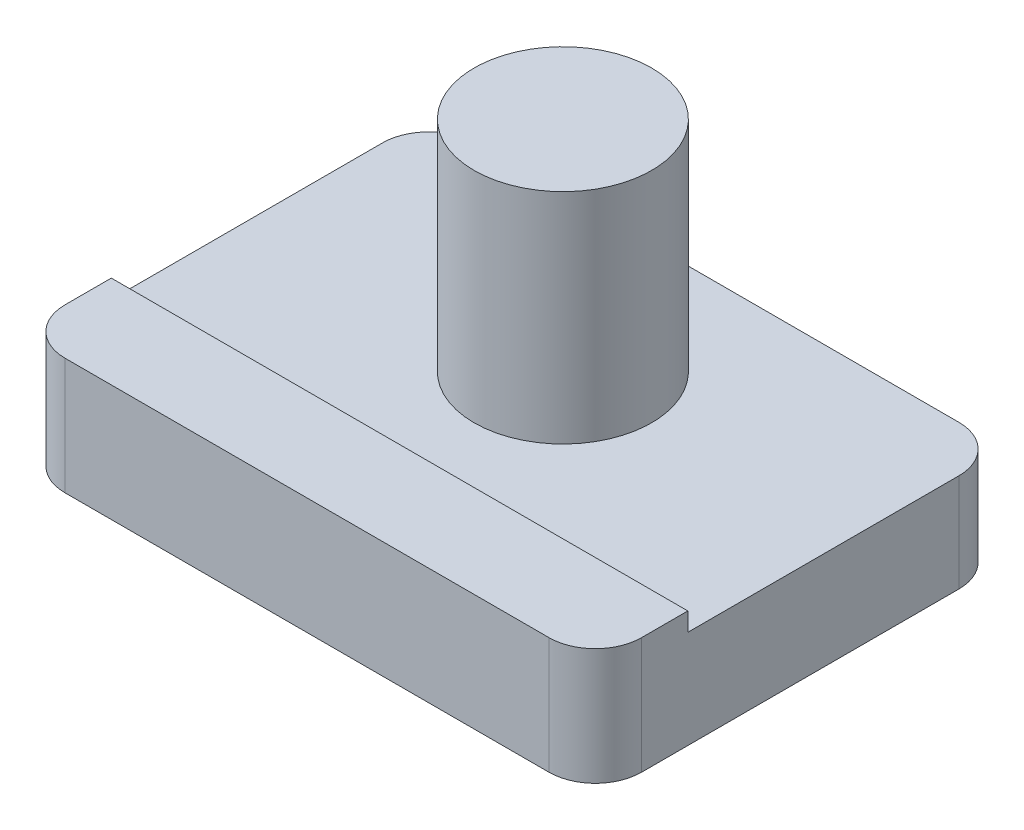
ISO-10303-21;
HEADER;
FILE_DESCRIPTION(('STEP AP214'),'2;1');
FILE_NAME('part.step','',(''),(''),'','','');
FILE_SCHEMA(('AUTOMOTIVE_DESIGN { 1 0 10303 214 1 1 1 1 }'));
ENDSEC;
DATA;
#1=APPLICATION_CONTEXT('core data for automotive mechanical design processes');
#2=APPLICATION_PROTOCOL_DEFINITION('international standard','automotive_design',2000,#1);
#3=PRODUCT_CONTEXT('',#1,'mechanical');
#4=PRODUCT('Part','Part','',(#3));
#5=PRODUCT_RELATED_PRODUCT_CATEGORY('part','',(#4));
#6=PRODUCT_DEFINITION_FORMATION('','',#4);
#7=PRODUCT_DEFINITION_CONTEXT('part definition',#1,'design');
#8=PRODUCT_DEFINITION('design','',#6,#7);
#9=PRODUCT_DEFINITION_SHAPE('','',#8);
#10=(LENGTH_UNIT() NAMED_UNIT(*) SI_UNIT(.MILLI.,.METRE.));
#11=(NAMED_UNIT(*) PLANE_ANGLE_UNIT() SI_UNIT($,.RADIAN.));
#12=(NAMED_UNIT(*) SI_UNIT($,.STERADIAN.) SOLID_ANGLE_UNIT());
#13=UNCERTAINTY_MEASURE_WITH_UNIT(LENGTH_MEASURE(1.E-05),#10,'distance_accuracy_value','');
#14=(GEOMETRIC_REPRESENTATION_CONTEXT(3) GLOBAL_UNCERTAINTY_ASSIGNED_CONTEXT((#13)) GLOBAL_UNIT_ASSIGNED_CONTEXT((#10,
#11,#12)) REPRESENTATION_CONTEXT('',''));
#15=CARTESIAN_POINT('',(0.,0.,0.));
#16=DIRECTION('',(0.,0.,1.));
#17=DIRECTION('',(1.,0.,0.));
#18=AXIS2_PLACEMENT_3D('',#15,#16,#17);
#19=CARTESIAN_POINT('',(31.15,10.6,0.));
#20=DIRECTION('',(1.,0.,0.));
#21=DIRECTION('',(0.,0.,-1.));
#22=AXIS2_PLACEMENT_3D('',#19,#20,#21);
#23=PLANE('',#22);
#24=DIRECTION('',(0.,0.,1.));
#25=VECTOR('',#24,1.);
#26=CARTESIAN_POINT('',(31.15,12.6,0.));
#27=LINE('',#26,#25);
#28=CARTESIAN_POINT('',(31.15,12.6,12.15));
#29=VERTEX_POINT('',#28);
#30=CARTESIAN_POINT('',(31.15,12.6,17.15));
#31=VERTEX_POINT('',#30);
#32=EDGE_CURVE('E127',#29,#31,#27,.T.);
#33=ORIENTED_EDGE('',*,*,#32,.T.);
#34=DIRECTION('',(0.,-1.,0.));
#35=VECTOR('',#34,1.);
#36=CARTESIAN_POINT('',(31.15,0.,17.15));
#37=LINE('',#36,#35);
#38=CARTESIAN_POINT('',(31.15,0.,17.15));
#39=VERTEX_POINT('',#38);
#40=EDGE_CURVE('E11',#31,#39,#37,.T.);
#41=ORIENTED_EDGE('',*,*,#40,.T.);
#42=DIRECTION('',(0.,0.,1.));
#43=VECTOR('',#42,1.);
#44=CARTESIAN_POINT('',(31.15,0.,0.));
#45=LINE('',#44,#43);
#46=CARTESIAN_POINT('',(31.15,0.,-17.15));
#47=VERTEX_POINT('',#46);
#48=EDGE_CURVE('E135',#47,#39,#45,.T.);
#49=ORIENTED_EDGE('',*,*,#48,.F.);
#50=DIRECTION('',(0.,-1.,0.));
#51=VECTOR('',#50,1.);
#52=CARTESIAN_POINT('',(31.15,10.6,-17.15));
#53=LINE('',#52,#51);
#54=CARTESIAN_POINT('',(31.15,10.6,-17.15));
#55=VERTEX_POINT('',#54);
#56=EDGE_CURVE('E56',#47,#55,#53,.F.);
#57=ORIENTED_EDGE('',*,*,#56,.T.);
#58=DIRECTION('',(0.,0.,1.));
#59=VECTOR('',#58,1.);
#60=CARTESIAN_POINT('',(31.15,10.6,0.));
#61=LINE('',#60,#59);
#62=CARTESIAN_POINT('',(31.15,10.6,12.15));
#63=VERTEX_POINT('',#62);
#64=EDGE_CURVE('E129',#55,#63,#61,.T.);
#65=ORIENTED_EDGE('',*,*,#64,.T.);
#66=DIRECTION('',(0.,-1.,0.));
#67=VECTOR('',#66,1.);
#68=CARTESIAN_POINT('',(31.15,12.6,12.15));
#69=LINE('',#68,#67);
#70=EDGE_CURVE('E125',#29,#63,#69,.T.);
#71=ORIENTED_EDGE('',*,*,#70,.F.);
#72=EDGE_LOOP('',(#33,#41,#49,#57,#65,#71));
#73=FACE_BOUND('',#72,.T.);
#74=ADVANCED_FACE('F47',(#73),#23,.T.);
#75=CARTESIAN_POINT('',(0.,10.6,-22.15));
#76=DIRECTION('',(0.,0.,-1.));
#77=DIRECTION('',(-1.,0.,0.));
#78=AXIS2_PLACEMENT_3D('',#75,#76,#77);
#79=PLANE('',#78);
#80=DIRECTION('',(1.,0.,0.));
#81=VECTOR('',#80,1.);
#82=CARTESIAN_POINT('',(0.,0.,-22.15));
#83=LINE('',#82,#81);
#84=CARTESIAN_POINT('',(-26.15,0.,-22.15));
#85=VERTEX_POINT('',#84);
#86=CARTESIAN_POINT('',(26.15,0.,-22.15));
#87=VERTEX_POINT('',#86);
#88=EDGE_CURVE('E184',#85,#87,#83,.T.);
#89=ORIENTED_EDGE('',*,*,#88,.F.);
#90=DIRECTION('',(0.,-1.,0.));
#91=VECTOR('',#90,1.);
#92=CARTESIAN_POINT('',(-26.15,10.6,-22.15));
#93=LINE('',#92,#91);
#94=CARTESIAN_POINT('',(-26.15,10.6,-22.15));
#95=VERTEX_POINT('',#94);
#96=EDGE_CURVE('E225',#85,#95,#93,.F.);
#97=ORIENTED_EDGE('',*,*,#96,.T.);
#98=DIRECTION('',(1.,0.,0.));
#99=VECTOR('',#98,1.);
#100=CARTESIAN_POINT('',(0.,10.6,-22.15));
#101=LINE('',#100,#99);
#102=CARTESIAN_POINT('',(26.15,10.6,-22.15));
#103=VERTEX_POINT('',#102);
#104=EDGE_CURVE('E170',#95,#103,#101,.T.);
#105=ORIENTED_EDGE('',*,*,#104,.T.);
#106=DIRECTION('',(0.,-1.,0.));
#107=VECTOR('',#106,1.);
#108=CARTESIAN_POINT('',(26.15,10.6,-22.15));
#109=LINE('',#108,#107);
#110=EDGE_CURVE('E221',#103,#87,#109,.T.);
#111=ORIENTED_EDGE('',*,*,#110,.T.);
#112=EDGE_LOOP('',(#89,#97,#105,#111));
#113=FACE_BOUND('',#112,.T.);
#114=ADVANCED_FACE('F248',(#113),#79,.T.);
#115=CARTESIAN_POINT('',(-31.15,10.6,0.));
#116=DIRECTION('',(1.,0.,0.));
#117=DIRECTION('',(0.,0.,-1.));
#118=AXIS2_PLACEMENT_3D('',#115,#116,#117);
#119=PLANE('',#118);
#120=DIRECTION('',(0.,0.,1.));
#121=VECTOR('',#120,1.);
#122=CARTESIAN_POINT('',(-31.15,0.,0.));
#123=LINE('',#122,#121);
#124=CARTESIAN_POINT('',(-31.15,0.,-17.15));
#125=VERTEX_POINT('',#124);
#126=CARTESIAN_POINT('',(-31.15,0.,17.15));
#127=VERTEX_POINT('',#126);
#128=EDGE_CURVE('E171',#125,#127,#123,.T.);
#129=ORIENTED_EDGE('',*,*,#128,.T.);
#130=DIRECTION('',(0.,-1.,0.));
#131=VECTOR('',#130,1.);
#132=CARTESIAN_POINT('',(-31.15,10.6,17.15));
#133=LINE('',#132,#131);
#134=CARTESIAN_POINT('',(-31.15,12.6,17.15));
#135=VERTEX_POINT('',#134);
#136=EDGE_CURVE('E213',#127,#135,#133,.F.);
#137=ORIENTED_EDGE('',*,*,#136,.T.);
#138=DIRECTION('',(0.,0.,1.));
#139=VECTOR('',#138,1.);
#140=CARTESIAN_POINT('',(-31.15,12.6,0.));
#141=LINE('',#140,#139);
#142=CARTESIAN_POINT('',(-31.15,12.6,12.15));
#143=VERTEX_POINT('',#142);
#144=EDGE_CURVE('E153',#143,#135,#141,.T.);
#145=ORIENTED_EDGE('',*,*,#144,.F.);
#146=DIRECTION('',(0.,-1.,0.));
#147=VECTOR('',#146,1.);
#148=CARTESIAN_POINT('',(-31.15,12.6,12.15));
#149=LINE('',#148,#147);
#150=CARTESIAN_POINT('',(-31.15,10.6,12.15));
#151=VERTEX_POINT('',#150);
#152=EDGE_CURVE('E136',#143,#151,#149,.T.);
#153=ORIENTED_EDGE('',*,*,#152,.T.);
#154=DIRECTION('',(0.,0.,1.));
#155=VECTOR('',#154,1.);
#156=CARTESIAN_POINT('',(-31.15,10.6,0.));
#157=LINE('',#156,#155);
#158=CARTESIAN_POINT('',(-31.15,10.6,-17.15));
#159=VERTEX_POINT('',#158);
#160=EDGE_CURVE('E174',#159,#151,#157,.T.);
#161=ORIENTED_EDGE('',*,*,#160,.F.);
#162=DIRECTION('',(0.,-1.,0.));
#163=VECTOR('',#162,1.);
#164=CARTESIAN_POINT('',(-31.15,0.,-17.15));
#165=LINE('',#164,#163);
#166=EDGE_CURVE('E209',#159,#125,#165,.T.);
#167=ORIENTED_EDGE('',*,*,#166,.T.);
#168=EDGE_LOOP('',(#129,#137,#145,#153,#161,#167));
#169=FACE_BOUND('',#168,.T.);
#170=ADVANCED_FACE('F240',(#169),#119,.F.);
#171=CARTESIAN_POINT('',(0.,10.6,0.));
#172=DIRECTION('',(0.,1.,0.));
#173=DIRECTION('',(0.,0.,1.));
#174=AXIS2_PLACEMENT_3D('',#171,#172,#173);
#175=PLANE('',#174);
#176=CARTESIAN_POINT('',(0.,10.6,-5.5002078342377));
#177=DIRECTION('',(0.,1.,0.));
#178=DIRECTION('',(0.,0.,1.));
#179=AXIS2_PLACEMENT_3D('',#176,#177,#178);
#180=CIRCLE('',#179,9.59372532332558);
#181=CARTESIAN_POINT('',(0.,10.6,4.09351748908788));
#182=VERTEX_POINT('',#181);
#183=EDGE_CURVE('E302',#182,#182,#180,.T.);
#184=ORIENTED_EDGE('',*,*,#183,.F.);
#185=EDGE_LOOP('',(#184));
#186=FACE_BOUND('',#185,.T.);
#187=ORIENTED_EDGE('',*,*,#104,.F.);
#188=CARTESIAN_POINT('',(-26.15,10.6,-17.15));
#189=DIRECTION('',(0.,1.,0.));
#190=DIRECTION('',(0.,0.,1.));
#191=AXIS2_PLACEMENT_3D('',#188,#189,#190);
#192=CIRCLE('',#191,5.);
#193=EDGE_CURVE('E230',#95,#159,#192,.T.);
#194=ORIENTED_EDGE('',*,*,#193,.T.);
#195=ORIENTED_EDGE('',*,*,#160,.T.);
#196=DIRECTION('',(1.,0.,0.));
#197=VECTOR('',#196,1.);
#198=CARTESIAN_POINT('',(0.,10.6,12.15));
#199=LINE('',#198,#197);
#200=EDGE_CURVE('E177',#151,#63,#199,.T.);
#201=ORIENTED_EDGE('',*,*,#200,.T.);
#202=ORIENTED_EDGE('',*,*,#64,.F.);
#203=CARTESIAN_POINT('',(26.15,10.6,-17.15));
#204=DIRECTION('',(0.,1.,0.));
#205=DIRECTION('',(0.,0.,1.));
#206=AXIS2_PLACEMENT_3D('',#203,#204,#205);
#207=CIRCLE('',#206,5.);
#208=EDGE_CURVE('E69',#55,#103,#207,.T.);
#209=ORIENTED_EDGE('',*,*,#208,.T.);
#210=EDGE_LOOP('',(#187,#194,#195,#201,#202,#209));
#211=FACE_BOUND('',#210,.T.);
#212=ADVANCED_FACE('F235',(#186,#211),#175,.T.);
#213=CARTESIAN_POINT('',(0.,0.,0.));
#214=DIRECTION('',(0.,1.,0.));
#215=DIRECTION('',(0.,0.,1.));
#216=AXIS2_PLACEMENT_3D('',#213,#214,#215);
#217=PLANE('',#216);
#218=DIRECTION('',(1.,0.,0.));
#219=VECTOR('',#218,1.);
#220=CARTESIAN_POINT('',(0.,0.,22.15));
#221=LINE('',#220,#219);
#222=CARTESIAN_POINT('',(-26.15,0.,22.15));
#223=VERTEX_POINT('',#222);
#224=CARTESIAN_POINT('',(26.15,0.,22.15));
#225=VERTEX_POINT('',#224);
#226=EDGE_CURVE('E147',#223,#225,#221,.T.);
#227=ORIENTED_EDGE('',*,*,#226,.F.);
#228=CARTESIAN_POINT('',(-26.15,0.,17.15));
#229=DIRECTION('',(0.,1.,0.));
#230=DIRECTION('',(0.,0.,1.));
#231=AXIS2_PLACEMENT_3D('',#228,#229,#230);
#232=CIRCLE('',#231,5.);
#233=EDGE_CURVE('E206',#223,#127,#232,.F.);
#234=ORIENTED_EDGE('',*,*,#233,.T.);
#235=ORIENTED_EDGE('',*,*,#128,.F.);
#236=CARTESIAN_POINT('',(-26.15,0.,-17.15));
#237=DIRECTION('',(0.,1.,0.));
#238=DIRECTION('',(0.,0.,1.));
#239=AXIS2_PLACEMENT_3D('',#236,#237,#238);
#240=CIRCLE('',#239,5.);
#241=EDGE_CURVE('E203',#125,#85,#240,.F.);
#242=ORIENTED_EDGE('',*,*,#241,.T.);
#243=ORIENTED_EDGE('',*,*,#88,.T.);
#244=CARTESIAN_POINT('',(26.15,0.,-17.15));
#245=DIRECTION('',(0.,1.,0.));
#246=DIRECTION('',(0.,0.,1.));
#247=AXIS2_PLACEMENT_3D('',#244,#245,#246);
#248=CIRCLE('',#247,5.);
#249=EDGE_CURVE('E197',#87,#47,#248,.F.);
#250=ORIENTED_EDGE('',*,*,#249,.T.);
#251=ORIENTED_EDGE('',*,*,#48,.T.);
#252=CARTESIAN_POINT('',(26.15,0.,17.15));
#253=DIRECTION('',(0.,1.,0.));
#254=DIRECTION('',(0.,0.,1.));
#255=AXIS2_PLACEMENT_3D('',#252,#253,#254);
#256=CIRCLE('',#255,5.);
#257=EDGE_CURVE('E200',#39,#225,#256,.F.);
#258=ORIENTED_EDGE('',*,*,#257,.T.);
#259=EDGE_LOOP('',(#227,#234,#235,#242,#243,#250,#251,#258));
#260=FACE_BOUND('',#259,.T.);
#261=ADVANCED_FACE('F246',(#260),#217,.F.);
#262=CARTESIAN_POINT('',(0.,12.6,12.15));
#263=DIRECTION('',(0.,0.,-1.));
#264=DIRECTION('',(-1.,0.,0.));
#265=AXIS2_PLACEMENT_3D('',#262,#263,#264);
#266=PLANE('',#265);
#267=ORIENTED_EDGE('',*,*,#200,.F.);
#268=ORIENTED_EDGE('',*,*,#152,.F.);
#269=DIRECTION('',(1.,0.,0.));
#270=VECTOR('',#269,1.);
#271=CARTESIAN_POINT('',(0.,12.6,12.15));
#272=LINE('',#271,#270);
#273=EDGE_CURVE('E142',#143,#29,#272,.T.);
#274=ORIENTED_EDGE('',*,*,#273,.T.);
#275=ORIENTED_EDGE('',*,*,#70,.T.);
#276=EDGE_LOOP('',(#267,#268,#274,#275));
#277=FACE_BOUND('',#276,.T.);
#278=ADVANCED_FACE('F149',(#277),#266,.T.);
#279=CARTESIAN_POINT('',(0.,12.6,22.15));
#280=DIRECTION('',(0.,0.,-1.));
#281=DIRECTION('',(-1.,0.,0.));
#282=AXIS2_PLACEMENT_3D('',#279,#280,#281);
#283=PLANE('',#282);
#284=DIRECTION('',(1.,0.,0.));
#285=VECTOR('',#284,1.);
#286=CARTESIAN_POINT('',(0.,12.6,22.15));
#287=LINE('',#286,#285);
#288=CARTESIAN_POINT('',(-26.15,12.6,22.15));
#289=VERTEX_POINT('',#288);
#290=CARTESIAN_POINT('',(26.15,12.6,22.15));
#291=VERTEX_POINT('',#290);
#292=EDGE_CURVE('E156',#289,#291,#287,.T.);
#293=ORIENTED_EDGE('',*,*,#292,.F.);
#294=DIRECTION('',(0.,-1.,0.));
#295=VECTOR('',#294,1.);
#296=CARTESIAN_POINT('',(-26.15,12.6,22.15));
#297=LINE('',#296,#295);
#298=EDGE_CURVE('E193',#289,#223,#297,.T.);
#299=ORIENTED_EDGE('',*,*,#298,.T.);
#300=ORIENTED_EDGE('',*,*,#226,.T.);
#301=DIRECTION('',(0.,-1.,0.));
#302=VECTOR('',#301,1.);
#303=CARTESIAN_POINT('',(26.15,12.6,22.15));
#304=LINE('',#303,#302);
#305=EDGE_CURVE('E180',#225,#291,#304,.F.);
#306=ORIENTED_EDGE('',*,*,#305,.T.);
#307=EDGE_LOOP('',(#293,#299,#300,#306));
#308=FACE_BOUND('',#307,.T.);
#309=ADVANCED_FACE('F256',(#308),#283,.F.);
#310=CARTESIAN_POINT('',(0.,12.6,0.));
#311=DIRECTION('',(0.,1.,0.));
#312=DIRECTION('',(0.,0.,1.));
#313=AXIS2_PLACEMENT_3D('',#310,#311,#312);
#314=PLANE('',#313);
#315=ORIENTED_EDGE('',*,*,#144,.T.);
#316=CARTESIAN_POINT('',(-26.15,12.6,17.15));
#317=DIRECTION('',(0.,1.,0.));
#318=DIRECTION('',(0.,0.,1.));
#319=AXIS2_PLACEMENT_3D('',#316,#317,#318);
#320=CIRCLE('',#319,5.);
#321=EDGE_CURVE('E218',#135,#289,#320,.T.);
#322=ORIENTED_EDGE('',*,*,#321,.T.);
#323=ORIENTED_EDGE('',*,*,#292,.T.);
#324=CARTESIAN_POINT('',(26.15,12.6,17.15));
#325=DIRECTION('',(0.,1.,0.));
#326=DIRECTION('',(0.,0.,1.));
#327=AXIS2_PLACEMENT_3D('',#324,#325,#326);
#328=CIRCLE('',#327,5.);
#329=EDGE_CURVE('E145',#291,#31,#328,.T.);
#330=ORIENTED_EDGE('',*,*,#329,.T.);
#331=ORIENTED_EDGE('',*,*,#32,.F.);
#332=ORIENTED_EDGE('',*,*,#273,.F.);
#333=EDGE_LOOP('',(#315,#322,#323,#330,#331,#332));
#334=FACE_BOUND('',#333,.T.);
#335=ADVANCED_FACE('F141',(#334),#314,.T.);
#336=CARTESIAN_POINT('',(0.,34.22,-5.5002078342377));
#337=DIRECTION('',(0.,-1.,0.));
#338=DIRECTION('',(0.,0.,-1.));
#339=AXIS2_PLACEMENT_3D('',#336,#337,#338);
#340=CYLINDRICAL_SURFACE('',#339,9.59372532332558);
#341=CARTESIAN_POINT('',(0.,34.22,-5.5002078342377));
#342=DIRECTION('',(0.,1.,0.));
#343=DIRECTION('',(0.,0.,1.));
#344=AXIS2_PLACEMENT_3D('',#341,#342,#343);
#345=CIRCLE('',#344,9.59372532332558);
#346=CARTESIAN_POINT('',(0.,34.22,4.09351748908788));
#347=VERTEX_POINT('',#346);
#348=EDGE_CURVE('E165',#347,#347,#345,.T.);
#349=ORIENTED_EDGE('',*,*,#348,.F.);
#350=EDGE_LOOP('',(#349));
#351=FACE_BOUND('',#350,.T.);
#352=ORIENTED_EDGE('',*,*,#183,.T.);
#353=EDGE_LOOP('',(#352));
#354=FACE_BOUND('',#353,.T.);
#355=ADVANCED_FACE('F271',(#351,#354),#340,.T.);
#356=CARTESIAN_POINT('',(0.,34.22,-5.5002078342377));
#357=DIRECTION('',(0.,1.,0.));
#358=DIRECTION('',(0.,0.,1.));
#359=AXIS2_PLACEMENT_3D('',#356,#357,#358);
#360=PLANE('',#359);
#361=ORIENTED_EDGE('',*,*,#348,.T.);
#362=EDGE_LOOP('',(#361));
#363=FACE_BOUND('',#362,.T.);
#364=ADVANCED_FACE('F263',(#363),#360,.T.);
#365=CARTESIAN_POINT('',(-26.15,12.6,17.15));
#366=DIRECTION('',(0.,-1.,0.));
#367=DIRECTION('',(0.,0.,-1.));
#368=AXIS2_PLACEMENT_3D('',#365,#366,#367);
#369=CYLINDRICAL_SURFACE('',#368,5.);
#370=ORIENTED_EDGE('',*,*,#321,.F.);
#371=ORIENTED_EDGE('',*,*,#136,.F.);
#372=ORIENTED_EDGE('',*,*,#233,.F.);
#373=ORIENTED_EDGE('',*,*,#298,.F.);
#374=EDGE_LOOP('',(#370,#371,#372,#373));
#375=FACE_BOUND('',#374,.T.);
#376=ADVANCED_FACE('F260',(#375),#369,.T.);
#377=CARTESIAN_POINT('',(-26.15,10.6,-17.15));
#378=DIRECTION('',(0.,1.,0.));
#379=DIRECTION('',(0.,0.,1.));
#380=AXIS2_PLACEMENT_3D('',#377,#378,#379);
#381=CYLINDRICAL_SURFACE('',#380,5.);
#382=ORIENTED_EDGE('',*,*,#193,.F.);
#383=ORIENTED_EDGE('',*,*,#96,.F.);
#384=ORIENTED_EDGE('',*,*,#241,.F.);
#385=ORIENTED_EDGE('',*,*,#166,.F.);
#386=EDGE_LOOP('',(#382,#383,#384,#385));
#387=FACE_BOUND('',#386,.T.);
#388=ADVANCED_FACE('F242',(#387),#381,.T.);
#389=CARTESIAN_POINT('',(26.15,10.6,17.15));
#390=DIRECTION('',(0.,1.,0.));
#391=DIRECTION('',(0.,0.,1.));
#392=AXIS2_PLACEMENT_3D('',#389,#390,#391);
#393=CYLINDRICAL_SURFACE('',#392,5.);
#394=ORIENTED_EDGE('',*,*,#329,.F.);
#395=ORIENTED_EDGE('',*,*,#305,.F.);
#396=ORIENTED_EDGE('',*,*,#257,.F.);
#397=ORIENTED_EDGE('',*,*,#40,.F.);
#398=EDGE_LOOP('',(#394,#395,#396,#397));
#399=FACE_BOUND('',#398,.T.);
#400=ADVANCED_FACE('F252',(#399),#393,.T.);
#401=CARTESIAN_POINT('',(26.15,10.6,-17.15));
#402=DIRECTION('',(0.,-1.,0.));
#403=DIRECTION('',(0.,0.,-1.));
#404=AXIS2_PLACEMENT_3D('',#401,#402,#403);
#405=CYLINDRICAL_SURFACE('',#404,5.);
#406=ORIENTED_EDGE('',*,*,#208,.F.);
#407=ORIENTED_EDGE('',*,*,#56,.F.);
#408=ORIENTED_EDGE('',*,*,#249,.F.);
#409=ORIENTED_EDGE('',*,*,#110,.F.);
#410=EDGE_LOOP('',(#406,#407,#408,#409));
#411=FACE_BOUND('',#410,.T.);
#412=ADVANCED_FACE('F49',(#411),#405,.T.);
#413=CLOSED_SHELL('',(#74,#114,#170,#212,#261,#278,#309,#335,#355,#364,#376,#388,#400,#412));
#414=MANIFOLD_SOLID_BREP('B2',#413);
#415=ADVANCED_BREP_SHAPE_REPRESENTATION('',(#18,#414),#14);
#416=SHAPE_DEFINITION_REPRESENTATION(#9,#415);
ENDSEC;
END-ISO-10303-21;
